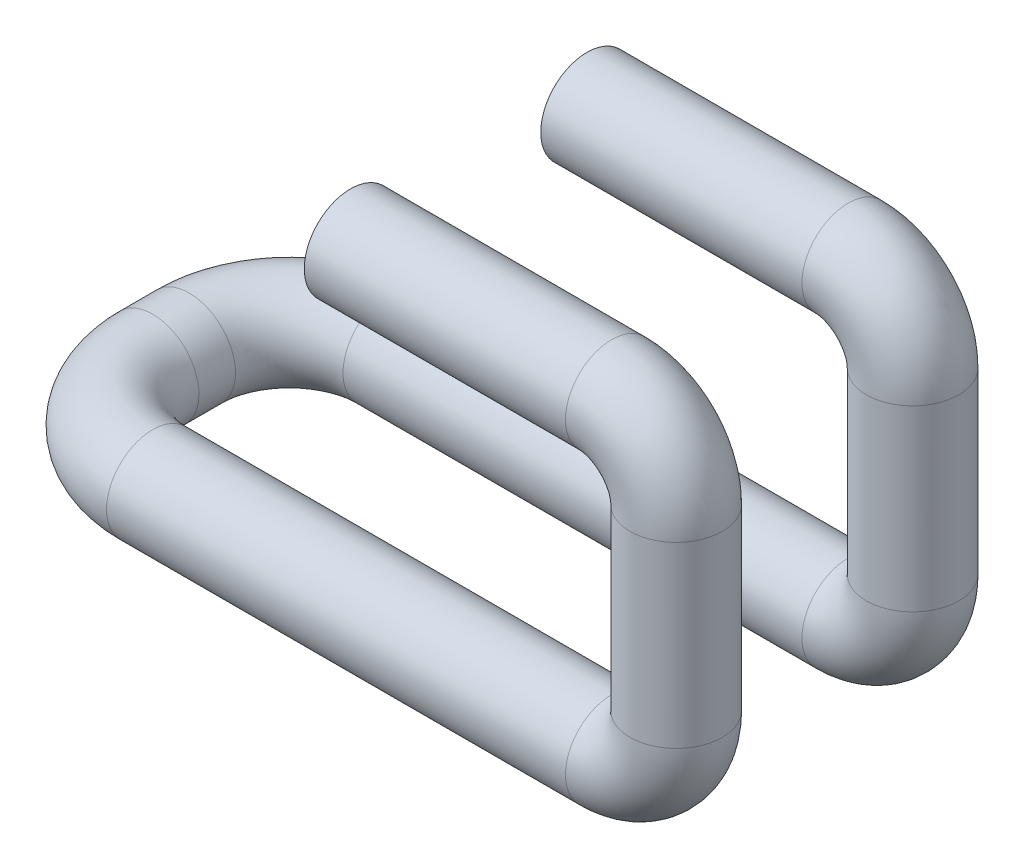
ISO-10303-21;
HEADER;
FILE_DESCRIPTION(('STEP AP214'),'2;1');
FILE_NAME('part.step','',(''),(''),'','','');
FILE_SCHEMA(('AUTOMOTIVE_DESIGN { 1 0 10303 214 1 1 1 1 }'));
ENDSEC;
DATA;
#1=APPLICATION_CONTEXT('core data for automotive mechanical design processes');
#2=APPLICATION_PROTOCOL_DEFINITION('international standard','automotive_design',2000,#1);
#3=PRODUCT_CONTEXT('',#1,'mechanical');
#4=PRODUCT('Part','Part','',(#3));
#5=PRODUCT_RELATED_PRODUCT_CATEGORY('part','',(#4));
#6=PRODUCT_DEFINITION_FORMATION('','',#4);
#7=PRODUCT_DEFINITION_CONTEXT('part definition',#1,'design');
#8=PRODUCT_DEFINITION('design','',#6,#7);
#9=PRODUCT_DEFINITION_SHAPE('','',#8);
#10=(LENGTH_UNIT() NAMED_UNIT(*) SI_UNIT(.MILLI.,.METRE.));
#11=(NAMED_UNIT(*) PLANE_ANGLE_UNIT() SI_UNIT($,.RADIAN.));
#12=(NAMED_UNIT(*) SI_UNIT($,.STERADIAN.) SOLID_ANGLE_UNIT());
#13=UNCERTAINTY_MEASURE_WITH_UNIT(LENGTH_MEASURE(1.E-05),#10,'distance_accuracy_value','');
#14=(GEOMETRIC_REPRESENTATION_CONTEXT(3) GLOBAL_UNCERTAINTY_ASSIGNED_CONTEXT((#13)) GLOBAL_UNIT_ASSIGNED_CONTEXT((#10,
#11,#12)) REPRESENTATION_CONTEXT('',''));
#15=CARTESIAN_POINT('',(0.,0.,0.));
#16=DIRECTION('',(0.,0.,1.));
#17=DIRECTION('',(1.,0.,0.));
#18=AXIS2_PLACEMENT_3D('',#15,#16,#17);
#19=CARTESIAN_POINT('',(17.5445851118081,31.8716664243214,-5.14219785351831));
#20=DIRECTION('',(1.,0.,0.));
#21=DIRECTION('',(0.,1.,0.));
#22=AXIS2_PLACEMENT_3D('',#19,#20,#21);
#23=PLANE('',#22);
#24=CARTESIAN_POINT('',(17.5445851118081,31.8716664243214,-5.14219785351831));
#25=DIRECTION('',(-1.,0.,0.));
#26=DIRECTION('',(0.,-1.,0.));
#27=AXIS2_PLACEMENT_3D('',#24,#25,#26);
#28=CIRCLE('',#27,0.5461);
#29=CARTESIAN_POINT('',(17.5445851118081,31.3255664243214,-5.14219785351831));
#30=VERTEX_POINT('',#29);
#31=EDGE_CURVE('E18',#30,#30,#28,.F.);
#32=ORIENTED_EDGE('',*,*,#31,.F.);
#33=EDGE_LOOP('',(#32));
#34=FACE_BOUND('',#33,.T.);
#35=ADVANCED_FACE('F15',(#34),#23,.F.);
#36=CARTESIAN_POINT('',(20.6306851118081,31.8716664243214,-5.14219785351831));
#37=DIRECTION('',(-1.,0.,0.));
#38=DIRECTION('',(0.,-1.,0.));
#39=AXIS2_PLACEMENT_3D('',#36,#37,#38);
#40=CYLINDRICAL_SURFACE('',#39,0.5461);
#41=CARTESIAN_POINT('',(20.630685111808,31.8716664243214,-5.14219785351831));
#42=DIRECTION('',(1.,0.,0.));
#43=DIRECTION('',(0.,1.,0.));
#44=AXIS2_PLACEMENT_3D('',#41,#42,#43);
#45=CIRCLE('',#44,0.5461);
#46=CARTESIAN_POINT('',(20.630685111808,32.4177664243214,-5.14219785351832));
#47=VERTEX_POINT('',#46);
#48=EDGE_CURVE('E107',#47,#47,#45,.T.);
#49=ORIENTED_EDGE('',*,*,#48,.F.);
#50=EDGE_LOOP('',(#49));
#51=FACE_BOUND('',#50,.T.);
#52=ORIENTED_EDGE('',*,*,#31,.T.);
#53=EDGE_LOOP('',(#52));
#54=FACE_BOUND('',#53,.T.);
#55=ADVANCED_FACE('F115',(#51,#54),#40,.T.);
#56=CARTESIAN_POINT('',(20.6306851118081,31.1096664243214,-5.14219785351831));
#57=DIRECTION('',(0.,0.,-1.));
#58=DIRECTION('',(-1.,0.,0.));
#59=AXIS2_PLACEMENT_3D('',#56,#57,#58);
#60=TOROIDAL_SURFACE('',#59,0.761999999999999,0.5461);
#61=ORIENTED_EDGE('',*,*,#48,.T.);
#62=EDGE_LOOP('',(#61));
#63=FACE_BOUND('',#62,.T.);
#64=CARTESIAN_POINT('',(21.392685111808,31.1096664243214,-5.14219785351831));
#65=DIRECTION('',(0.,-1.,0.));
#66=DIRECTION('',(0.,0.,-1.));
#67=AXIS2_PLACEMENT_3D('',#64,#65,#66);
#68=CIRCLE('',#67,0.546100000000001);
#69=CARTESIAN_POINT('',(21.392685111808,31.1096664243214,-5.68829785351831));
#70=VERTEX_POINT('',#69);
#71=EDGE_CURVE('E103',#70,#70,#68,.T.);
#72=ORIENTED_EDGE('',*,*,#71,.F.);
#73=EDGE_LOOP('',(#72));
#74=FACE_BOUND('',#73,.T.);
#75=ADVANCED_FACE('F111',(#63,#74),#60,.T.);
#76=CARTESIAN_POINT('',(17.5445851118081,31.8716664243213,-7.93619785351827));
#77=DIRECTION('',(-1.,0.,0.));
#78=DIRECTION('',(0.,0.,1.));
#79=AXIS2_PLACEMENT_3D('',#76,#77,#78);
#80=PLANE('',#79);
#81=CARTESIAN_POINT('',(17.5445851118081,31.8716664243213,-7.93619785351827));
#82=DIRECTION('',(-1.,0.,0.));
#83=DIRECTION('',(0.,0.,1.));
#84=AXIS2_PLACEMENT_3D('',#81,#82,#83);
#85=CIRCLE('',#84,0.5461);
#86=CARTESIAN_POINT('',(17.5445851118081,31.8716664243213,-7.39009785351827));
#87=VERTEX_POINT('',#86);
#88=EDGE_CURVE('E99',#87,#87,#85,.F.);
#89=ORIENTED_EDGE('',*,*,#88,.F.);
#90=EDGE_LOOP('',(#89));
#91=FACE_BOUND('',#90,.T.);
#92=ADVANCED_FACE('F114',(#91),#80,.T.);
#93=CARTESIAN_POINT('',(21.392685111808,31.1096664243214,-5.14219785351831));
#94=DIRECTION('',(0.,-1.,0.));
#95=DIRECTION('',(0.,0.,-1.));
#96=AXIS2_PLACEMENT_3D('',#93,#94,#95);
#97=CYLINDRICAL_SURFACE('',#96,0.546100000000001);
#98=ORIENTED_EDGE('',*,*,#71,.T.);
#99=EDGE_LOOP('',(#98));
#100=FACE_BOUND('',#99,.T.);
#101=CARTESIAN_POINT('',(21.392685111808,29.0014664243214,-5.1421978535183));
#102=DIRECTION('',(0.,-1.,0.));
#103=DIRECTION('',(1.,0.,0.));
#104=AXIS2_PLACEMENT_3D('',#101,#102,#103);
#105=CIRCLE('',#104,0.5461);
#106=CARTESIAN_POINT('',(21.938785111808,29.0014664243214,-5.1421978535183));
#107=VERTEX_POINT('',#106);
#108=EDGE_CURVE('E94',#107,#107,#105,.T.);
#109=ORIENTED_EDGE('',*,*,#108,.F.);
#110=EDGE_LOOP('',(#109));
#111=FACE_BOUND('',#110,.T.);
#112=ADVANCED_FACE('F175',(#100,#111),#97,.T.);
#113=CARTESIAN_POINT('',(20.6306851118081,31.8716664243213,-7.93619785351829));
#114=DIRECTION('',(-1.,0.,0.));
#115=DIRECTION('',(0.,0.,1.));
#116=AXIS2_PLACEMENT_3D('',#113,#114,#115);
#117=CYLINDRICAL_SURFACE('',#116,0.5461);
#118=ORIENTED_EDGE('',*,*,#88,.T.);
#119=EDGE_LOOP('',(#118));
#120=FACE_BOUND('',#119,.T.);
#121=CARTESIAN_POINT('',(20.6306851118081,31.8716664243214,-7.93619785351829));
#122=DIRECTION('',(-1.,0.,0.));
#123=DIRECTION('',(0.,1.,0.));
#124=AXIS2_PLACEMENT_3D('',#121,#122,#123);
#125=CIRCLE('',#124,0.5461);
#126=CARTESIAN_POINT('',(20.6306851118081,32.4177664243214,-7.93619785351829));
#127=VERTEX_POINT('',#126);
#128=EDGE_CURVE('E98',#127,#127,#125,.F.);
#129=ORIENTED_EDGE('',*,*,#128,.F.);
#130=EDGE_LOOP('',(#129));
#131=FACE_BOUND('',#130,.T.);
#132=ADVANCED_FACE('F89',(#120,#131),#117,.T.);
#133=CARTESIAN_POINT('',(20.6306851118081,29.0014664243214,-5.1421978535183));
#134=DIRECTION('',(0.,0.,-1.));
#135=DIRECTION('',(0.,-1.,0.));
#136=AXIS2_PLACEMENT_3D('',#133,#134,#135);
#137=TOROIDAL_SURFACE('',#136,0.761999999999999,0.5461);
#138=CARTESIAN_POINT('',(20.6306851118081,28.2394664243214,-5.1421978535183));
#139=DIRECTION('',(-1.,0.,0.));
#140=DIRECTION('',(0.,0.,1.));
#141=AXIS2_PLACEMENT_3D('',#138,#139,#140);
#142=CIRCLE('',#141,0.5461);
#143=CARTESIAN_POINT('',(20.6306851118081,28.2394664243214,-4.5960978535183));
#144=VERTEX_POINT('',#143);
#145=EDGE_CURVE('E78',#144,#144,#142,.T.);
#146=ORIENTED_EDGE('',*,*,#145,.F.);
#147=EDGE_LOOP('',(#146));
#148=FACE_BOUND('',#147,.T.);
#149=ORIENTED_EDGE('',*,*,#108,.T.);
#150=EDGE_LOOP('',(#149));
#151=FACE_BOUND('',#150,.T.);
#152=ADVANCED_FACE('F85',(#148,#151),#137,.T.);
#153=CARTESIAN_POINT('',(20.6306851118081,31.1096664243214,-7.93619785351829));
#154=DIRECTION('',(0.,0.,1.));
#155=DIRECTION('',(1.,0.,0.));
#156=AXIS2_PLACEMENT_3D('',#153,#154,#155);
#157=TOROIDAL_SURFACE('',#156,0.761999999999999,0.5461);
#158=ORIENTED_EDGE('',*,*,#128,.T.);
#159=EDGE_LOOP('',(#158));
#160=FACE_BOUND('',#159,.T.);
#161=CARTESIAN_POINT('',(21.392685111808,31.1096664243214,-7.93619785351828));
#162=DIRECTION('',(0.,1.,0.));
#163=DIRECTION('',(0.,0.,1.));
#164=AXIS2_PLACEMENT_3D('',#161,#162,#163);
#165=CIRCLE('',#164,0.546100000000001);
#166=CARTESIAN_POINT('',(21.392685111808,31.1096664243214,-7.39009785351828));
#167=VERTEX_POINT('',#166);
#168=EDGE_CURVE('E74',#167,#167,#165,.F.);
#169=ORIENTED_EDGE('',*,*,#168,.F.);
#170=EDGE_LOOP('',(#169));
#171=FACE_BOUND('',#170,.T.);
#172=ADVANCED_FACE('F82',(#160,#171),#157,.T.);
#173=CARTESIAN_POINT('',(20.6306851118081,28.2394664243214,-5.1421978535183));
#174=DIRECTION('',(-1.,0.,0.));
#175=DIRECTION('',(0.,0.,1.));
#176=AXIS2_PLACEMENT_3D('',#173,#174,#175);
#177=CYLINDRICAL_SURFACE('',#176,0.5461);
#178=ORIENTED_EDGE('',*,*,#145,.T.);
#179=EDGE_LOOP('',(#178));
#180=FACE_BOUND('',#179,.T.);
#181=CARTESIAN_POINT('',(15.2077851118081,28.2394664243214,-5.14219785351828));
#182=DIRECTION('',(-1.,0.,0.));
#183=DIRECTION('',(0.,0.,1.));
#184=AXIS2_PLACEMENT_3D('',#181,#182,#183);
#185=CIRCLE('',#184,0.5461);
#186=CARTESIAN_POINT('',(15.2077851118081,28.2394664243214,-4.59609785351828));
#187=VERTEX_POINT('',#186);
#188=EDGE_CURVE('E70',#187,#187,#185,.T.);
#189=ORIENTED_EDGE('',*,*,#188,.F.);
#190=EDGE_LOOP('',(#189));
#191=FACE_BOUND('',#190,.T.);
#192=ADVANCED_FACE('F62',(#180,#191),#177,.T.);
#193=CARTESIAN_POINT('',(15.2077851118081,28.2394664243214,-6.32329785351828));
#194=DIRECTION('',(0.,-1.,0.));
#195=DIRECTION('',(1.,0.,0.));
#196=AXIS2_PLACEMENT_3D('',#193,#194,#195);
#197=TOROIDAL_SURFACE('',#196,1.1811,0.5461);
#198=CARTESIAN_POINT('',(14.0266851118081,28.2394664243214,-6.32329785351827));
#199=DIRECTION('',(0.,0.,-1.));
#200=DIRECTION('',(0.,1.,0.));
#201=AXIS2_PLACEMENT_3D('',#198,#199,#200);
#202=CIRCLE('',#201,0.546100000000001);
#203=CARTESIAN_POINT('',(14.0266851118081,28.7855664243214,-6.32329785351827));
#204=VERTEX_POINT('',#203);
#205=EDGE_CURVE('E68',#204,#204,#202,.T.);
#206=ORIENTED_EDGE('',*,*,#205,.F.);
#207=EDGE_LOOP('',(#206));
#208=FACE_BOUND('',#207,.T.);
#209=ORIENTED_EDGE('',*,*,#188,.T.);
#210=EDGE_LOOP('',(#209));
#211=FACE_BOUND('',#210,.T.);
#212=ADVANCED_FACE('F57',(#208,#211),#197,.T.);
#213=CARTESIAN_POINT('',(21.392685111808,29.0014664243214,-7.93619785351829));
#214=DIRECTION('',(0.,1.,0.));
#215=DIRECTION('',(0.,0.,1.));
#216=AXIS2_PLACEMENT_3D('',#213,#214,#215);
#217=CYLINDRICAL_SURFACE('',#216,0.546100000000001);
#218=ORIENTED_EDGE('',*,*,#168,.T.);
#219=EDGE_LOOP('',(#218));
#220=FACE_BOUND('',#219,.T.);
#221=CARTESIAN_POINT('',(21.392685111808,29.0014664243214,-7.93619785351829));
#222=DIRECTION('',(0.,1.,0.));
#223=DIRECTION('',(1.,0.,0.));
#224=AXIS2_PLACEMENT_3D('',#221,#222,#223);
#225=CIRCLE('',#224,0.5461);
#226=CARTESIAN_POINT('',(21.938785111808,29.0014664243214,-7.93619785351829));
#227=VERTEX_POINT('',#226);
#228=EDGE_CURVE('E283',#227,#227,#225,.F.);
#229=ORIENTED_EDGE('',*,*,#228,.F.);
#230=EDGE_LOOP('',(#229));
#231=FACE_BOUND('',#230,.T.);
#232=ADVANCED_FACE('F53',(#220,#231),#217,.T.);
#233=CARTESIAN_POINT('',(14.0266851118081,28.2394664243214,-6.32329785351827));
#234=DIRECTION('',(0.,0.,-1.));
#235=DIRECTION('',(0.,1.,0.));
#236=AXIS2_PLACEMENT_3D('',#233,#234,#235);
#237=CYLINDRICAL_SURFACE('',#236,0.546100000000001);
#238=ORIENTED_EDGE('',*,*,#205,.T.);
#239=EDGE_LOOP('',(#238));
#240=FACE_BOUND('',#239,.T.);
#241=CARTESIAN_POINT('',(14.026685111808,28.2394664243214,-6.75509785351828));
#242=DIRECTION('',(0.,0.,-1.));
#243=DIRECTION('',(-1.,0.,0.));
#244=AXIS2_PLACEMENT_3D('',#241,#242,#243);
#245=CIRCLE('',#244,0.5461);
#246=CARTESIAN_POINT('',(13.480585111808,28.2394664243214,-6.75509785351828));
#247=VERTEX_POINT('',#246);
#248=EDGE_CURVE('E32',#247,#247,#245,.T.);
#249=ORIENTED_EDGE('',*,*,#248,.F.);
#250=EDGE_LOOP('',(#249));
#251=FACE_BOUND('',#250,.T.);
#252=ADVANCED_FACE('F49',(#240,#251),#237,.T.);
#253=CARTESIAN_POINT('',(15.2077851118081,28.2394664243214,-6.75509785351828));
#254=DIRECTION('',(0.,-1.,0.));
#255=DIRECTION('',(1.,0.,0.));
#256=AXIS2_PLACEMENT_3D('',#253,#254,#255);
#257=TOROIDAL_SURFACE('',#256,1.1811,0.5461);
#258=ORIENTED_EDGE('',*,*,#248,.T.);
#259=EDGE_LOOP('',(#258));
#260=FACE_BOUND('',#259,.T.);
#261=CARTESIAN_POINT('',(15.2077851118081,28.2394664243214,-7.93619785351829));
#262=DIRECTION('',(1.,0.,0.));
#263=DIRECTION('',(0.,1.,0.));
#264=AXIS2_PLACEMENT_3D('',#261,#262,#263);
#265=CIRCLE('',#264,0.546100000000001);
#266=CARTESIAN_POINT('',(15.2077851118081,28.7855664243214,-7.93619785351829));
#267=VERTEX_POINT('',#266);
#268=EDGE_CURVE('E23',#267,#267,#265,.T.);
#269=ORIENTED_EDGE('',*,*,#268,.F.);
#270=EDGE_LOOP('',(#269));
#271=FACE_BOUND('',#270,.T.);
#272=ADVANCED_FACE('F45',(#260,#271),#257,.T.);
#273=CARTESIAN_POINT('',(20.6306851118081,29.0014664243214,-7.93619785351829));
#274=DIRECTION('',(0.,0.,1.));
#275=DIRECTION('',(1.,0.,0.));
#276=AXIS2_PLACEMENT_3D('',#273,#274,#275);
#277=TOROIDAL_SURFACE('',#276,0.761999999999992,0.5461);
#278=CARTESIAN_POINT('',(20.6306851118081,28.2394664243214,-7.93619785351829));
#279=DIRECTION('',(1.,0.,0.));
#280=DIRECTION('',(0.,1.,0.));
#281=AXIS2_PLACEMENT_3D('',#278,#279,#280);
#282=CIRCLE('',#281,0.546100000000001);
#283=CARTESIAN_POINT('',(20.6306851118081,28.7855664243214,-7.93619785351829));
#284=VERTEX_POINT('',#283);
#285=EDGE_CURVE('E10',#284,#284,#282,.F.);
#286=ORIENTED_EDGE('',*,*,#285,.F.);
#287=EDGE_LOOP('',(#286));
#288=FACE_BOUND('',#287,.T.);
#289=ORIENTED_EDGE('',*,*,#228,.T.);
#290=EDGE_LOOP('',(#289));
#291=FACE_BOUND('',#290,.T.);
#292=ADVANCED_FACE('F40',(#288,#291),#277,.T.);
#293=CARTESIAN_POINT('',(15.2077851118081,28.2394664243214,-7.93619785351829));
#294=DIRECTION('',(1.,0.,0.));
#295=DIRECTION('',(0.,1.,0.));
#296=AXIS2_PLACEMENT_3D('',#293,#294,#295);
#297=CYLINDRICAL_SURFACE('',#296,0.546100000000001);
#298=ORIENTED_EDGE('',*,*,#268,.T.);
#299=EDGE_LOOP('',(#298));
#300=FACE_BOUND('',#299,.T.);
#301=ORIENTED_EDGE('',*,*,#285,.T.);
#302=EDGE_LOOP('',(#301));
#303=FACE_BOUND('',#302,.T.);
#304=ADVANCED_FACE('F44',(#300,#303),#297,.T.);
#305=CLOSED_SHELL('',(#35,#55,#75,#92,#112,#132,#152,#172,#192,#212,#232,#252,#272,#292,#304));
#306=MANIFOLD_SOLID_BREP('B1',#305);
#307=ADVANCED_BREP_SHAPE_REPRESENTATION('',(#18,#306),#14);
#308=SHAPE_DEFINITION_REPRESENTATION(#9,#307);
ENDSEC;
END-ISO-10303-21;
